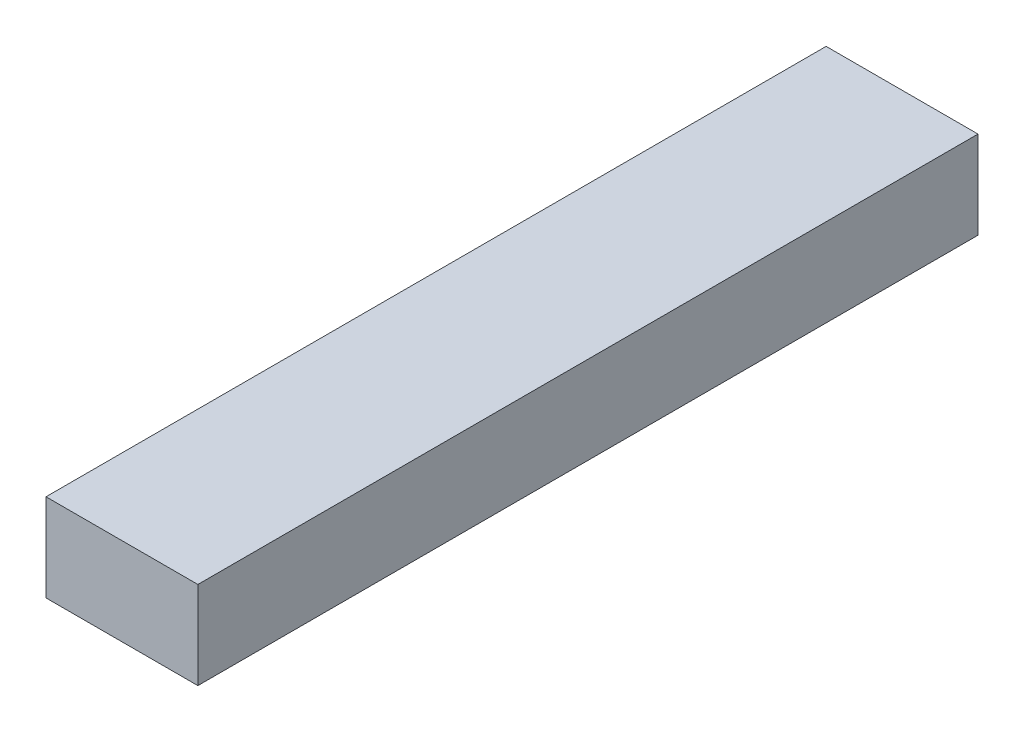
ISO-10303-21;
HEADER;
FILE_DESCRIPTION(('STEP AP214'),'2;1');
FILE_NAME('part.step','',(''),(''),'','','');
FILE_SCHEMA(('AUTOMOTIVE_DESIGN { 1 0 10303 214 1 1 1 1 }'));
ENDSEC;
DATA;
#1=APPLICATION_CONTEXT('core data for automotive mechanical design processes');
#2=APPLICATION_PROTOCOL_DEFINITION('international standard','automotive_design',2000,#1);
#3=PRODUCT_CONTEXT('',#1,'mechanical');
#4=PRODUCT('Part','Part','',(#3));
#5=PRODUCT_RELATED_PRODUCT_CATEGORY('part','',(#4));
#6=PRODUCT_DEFINITION_FORMATION('','',#4);
#7=PRODUCT_DEFINITION_CONTEXT('part definition',#1,'design');
#8=PRODUCT_DEFINITION('design','',#6,#7);
#9=PRODUCT_DEFINITION_SHAPE('','',#8);
#10=(LENGTH_UNIT() NAMED_UNIT(*) SI_UNIT(.MILLI.,.METRE.));
#11=(NAMED_UNIT(*) PLANE_ANGLE_UNIT() SI_UNIT($,.RADIAN.));
#12=(NAMED_UNIT(*) SI_UNIT($,.STERADIAN.) SOLID_ANGLE_UNIT());
#13=UNCERTAINTY_MEASURE_WITH_UNIT(LENGTH_MEASURE(1.E-05),#10,'distance_accuracy_value','');
#14=(GEOMETRIC_REPRESENTATION_CONTEXT(3) GLOBAL_UNCERTAINTY_ASSIGNED_CONTEXT((#13)) GLOBAL_UNIT_ASSIGNED_CONTEXT((#10,
#11,#12)) REPRESENTATION_CONTEXT('',''));
#15=CARTESIAN_POINT('',(0.,0.,0.));
#16=DIRECTION('',(0.,0.,1.));
#17=DIRECTION('',(1.,0.,0.));
#18=AXIS2_PLACEMENT_3D('',#15,#16,#17);
#19=CARTESIAN_POINT('',(15.47,18.,-79.71));
#20=DIRECTION('',(1.,0.,0.));
#21=DIRECTION('',(0.,0.,-1.));
#22=AXIS2_PLACEMENT_3D('',#19,#20,#21);
#23=PLANE('',#22);
#24=DIRECTION('',(0.,0.,1.));
#25=VECTOR('',#24,1.);
#26=CARTESIAN_POINT('',(15.47,15.,-79.71));
#27=LINE('',#26,#25);
#28=CARTESIAN_POINT('',(15.47,15.,-79.71));
#29=VERTEX_POINT('',#28);
#30=CARTESIAN_POINT('',(15.47,15.,-53.));
#31=VERTEX_POINT('',#30);
#32=EDGE_CURVE('E102',#29,#31,#27,.T.);
#33=ORIENTED_EDGE('',*,*,#32,.T.);
#34=DIRECTION('',(0.,-1.,0.));
#35=VECTOR('',#34,1.);
#36=CARTESIAN_POINT('',(15.47,18.,-53.));
#37=LINE('',#36,#35);
#38=CARTESIAN_POINT('',(15.47,18.,-53.));
#39=VERTEX_POINT('',#38);
#40=EDGE_CURVE('E11',#39,#31,#37,.T.);
#41=ORIENTED_EDGE('',*,*,#40,.F.);
#42=DIRECTION('',(0.,0.,1.));
#43=VECTOR('',#42,1.);
#44=CARTESIAN_POINT('',(15.47,18.,-79.71));
#45=LINE('',#44,#43);
#46=CARTESIAN_POINT('',(15.47,18.,-79.71));
#47=VERTEX_POINT('',#46);
#48=EDGE_CURVE('E90',#47,#39,#45,.T.);
#49=ORIENTED_EDGE('',*,*,#48,.F.);
#50=DIRECTION('',(0.,-1.,0.));
#51=VECTOR('',#50,1.);
#52=CARTESIAN_POINT('',(15.47,18.,-79.71));
#53=LINE('',#52,#51);
#54=EDGE_CURVE('E98',#47,#29,#53,.T.);
#55=ORIENTED_EDGE('',*,*,#54,.T.);
#56=EDGE_LOOP('',(#33,#41,#49,#55));
#57=FACE_BOUND('',#56,.T.);
#58=ADVANCED_FACE('F39',(#57),#23,.F.);
#59=CARTESIAN_POINT('',(15.47,18.,-53.));
#60=DIRECTION('',(0.,0.,-1.));
#61=DIRECTION('',(-1.,0.,0.));
#62=AXIS2_PLACEMENT_3D('',#59,#60,#61);
#63=PLANE('',#62);
#64=DIRECTION('',(1.,0.,0.));
#65=VECTOR('',#64,1.);
#66=CARTESIAN_POINT('',(15.47,15.,-53.));
#67=LINE('',#66,#65);
#68=CARTESIAN_POINT('',(20.67,15.,-53.));
#69=VERTEX_POINT('',#68);
#70=EDGE_CURVE('E94',#31,#69,#67,.T.);
#71=ORIENTED_EDGE('',*,*,#70,.T.);
#72=DIRECTION('',(0.,-1.,0.));
#73=VECTOR('',#72,1.);
#74=CARTESIAN_POINT('',(20.67,18.,-53.));
#75=LINE('',#74,#73);
#76=CARTESIAN_POINT('',(20.67,18.,-53.));
#77=VERTEX_POINT('',#76);
#78=EDGE_CURVE('E47',#77,#69,#75,.T.);
#79=ORIENTED_EDGE('',*,*,#78,.F.);
#80=DIRECTION('',(1.,0.,0.));
#81=VECTOR('',#80,1.);
#82=CARTESIAN_POINT('',(15.47,18.,-53.));
#83=LINE('',#82,#81);
#84=EDGE_CURVE('E85',#39,#77,#83,.T.);
#85=ORIENTED_EDGE('',*,*,#84,.F.);
#86=ORIENTED_EDGE('',*,*,#40,.T.);
#87=EDGE_LOOP('',(#71,#79,#85,#86));
#88=FACE_BOUND('',#87,.T.);
#89=ADVANCED_FACE('F93',(#88),#63,.F.);
#90=CARTESIAN_POINT('',(20.67,18.,-79.71));
#91=DIRECTION('',(-1.,0.,0.));
#92=DIRECTION('',(0.,0.,1.));
#93=AXIS2_PLACEMENT_3D('',#90,#91,#92);
#94=PLANE('',#93);
#95=DIRECTION('',(0.,0.,-1.));
#96=VECTOR('',#95,1.);
#97=CARTESIAN_POINT('',(20.67,15.,-79.71));
#98=LINE('',#97,#96);
#99=CARTESIAN_POINT('',(20.67,15.,-79.71));
#100=VERTEX_POINT('',#99);
#101=EDGE_CURVE('E72',#69,#100,#98,.T.);
#102=ORIENTED_EDGE('',*,*,#101,.T.);
#103=DIRECTION('',(0.,-1.,0.));
#104=VECTOR('',#103,1.);
#105=CARTESIAN_POINT('',(20.67,18.,-79.71));
#106=LINE('',#105,#104);
#107=CARTESIAN_POINT('',(20.67,18.,-79.71));
#108=VERTEX_POINT('',#107);
#109=EDGE_CURVE('E95',#108,#100,#106,.T.);
#110=ORIENTED_EDGE('',*,*,#109,.F.);
#111=DIRECTION('',(0.,0.,-1.));
#112=VECTOR('',#111,1.);
#113=CARTESIAN_POINT('',(20.67,18.,-79.71));
#114=LINE('',#113,#112);
#115=EDGE_CURVE('E88',#77,#108,#114,.T.);
#116=ORIENTED_EDGE('',*,*,#115,.F.);
#117=ORIENTED_EDGE('',*,*,#78,.T.);
#118=EDGE_LOOP('',(#102,#110,#116,#117));
#119=FACE_BOUND('',#118,.T.);
#120=ADVANCED_FACE('F96',(#119),#94,.F.);
#121=CARTESIAN_POINT('',(15.47,18.,-79.71));
#122=DIRECTION('',(0.,0.,1.));
#123=DIRECTION('',(1.,0.,0.));
#124=AXIS2_PLACEMENT_3D('',#121,#122,#123);
#125=PLANE('',#124);
#126=DIRECTION('',(-1.,0.,0.));
#127=VECTOR('',#126,1.);
#128=CARTESIAN_POINT('',(15.47,15.,-79.71));
#129=LINE('',#128,#127);
#130=EDGE_CURVE('E78',#100,#29,#129,.T.);
#131=ORIENTED_EDGE('',*,*,#130,.T.);
#132=ORIENTED_EDGE('',*,*,#54,.F.);
#133=DIRECTION('',(-1.,0.,0.));
#134=VECTOR('',#133,1.);
#135=CARTESIAN_POINT('',(15.47,18.,-79.71));
#136=LINE('',#135,#134);
#137=EDGE_CURVE('E55',#108,#47,#136,.T.);
#138=ORIENTED_EDGE('',*,*,#137,.F.);
#139=ORIENTED_EDGE('',*,*,#109,.T.);
#140=EDGE_LOOP('',(#131,#132,#138,#139));
#141=FACE_BOUND('',#140,.T.);
#142=ADVANCED_FACE('F109',(#141),#125,.F.);
#143=CARTESIAN_POINT('',(0.,18.,0.));
#144=DIRECTION('',(0.,1.,0.));
#145=DIRECTION('',(0.,0.,1.));
#146=AXIS2_PLACEMENT_3D('',#143,#144,#145);
#147=PLANE('',#146);
#148=ORIENTED_EDGE('',*,*,#48,.T.);
#149=ORIENTED_EDGE('',*,*,#84,.T.);
#150=ORIENTED_EDGE('',*,*,#115,.T.);
#151=ORIENTED_EDGE('',*,*,#137,.T.);
#152=EDGE_LOOP('',(#148,#149,#150,#151));
#153=FACE_BOUND('',#152,.T.);
#154=ADVANCED_FACE('F86',(#153),#147,.T.);
#155=CARTESIAN_POINT('',(0.,15.,0.));
#156=DIRECTION('',(0.,1.,0.));
#157=DIRECTION('',(0.,0.,1.));
#158=AXIS2_PLACEMENT_3D('',#155,#156,#157);
#159=PLANE('',#158);
#160=ORIENTED_EDGE('',*,*,#32,.F.);
#161=ORIENTED_EDGE('',*,*,#130,.F.);
#162=ORIENTED_EDGE('',*,*,#101,.F.);
#163=ORIENTED_EDGE('',*,*,#70,.F.);
#164=EDGE_LOOP('',(#160,#161,#162,#163));
#165=FACE_BOUND('',#164,.T.);
#166=ADVANCED_FACE('F112',(#165),#159,.F.);
#167=CLOSED_SHELL('',(#58,#89,#120,#142,#154,#166));
#168=MANIFOLD_SOLID_BREP('B2',#167);
#169=ADVANCED_BREP_SHAPE_REPRESENTATION('',(#18,#168),#14);
#170=SHAPE_DEFINITION_REPRESENTATION(#9,#169);
ENDSEC;
END-ISO-10303-21;
